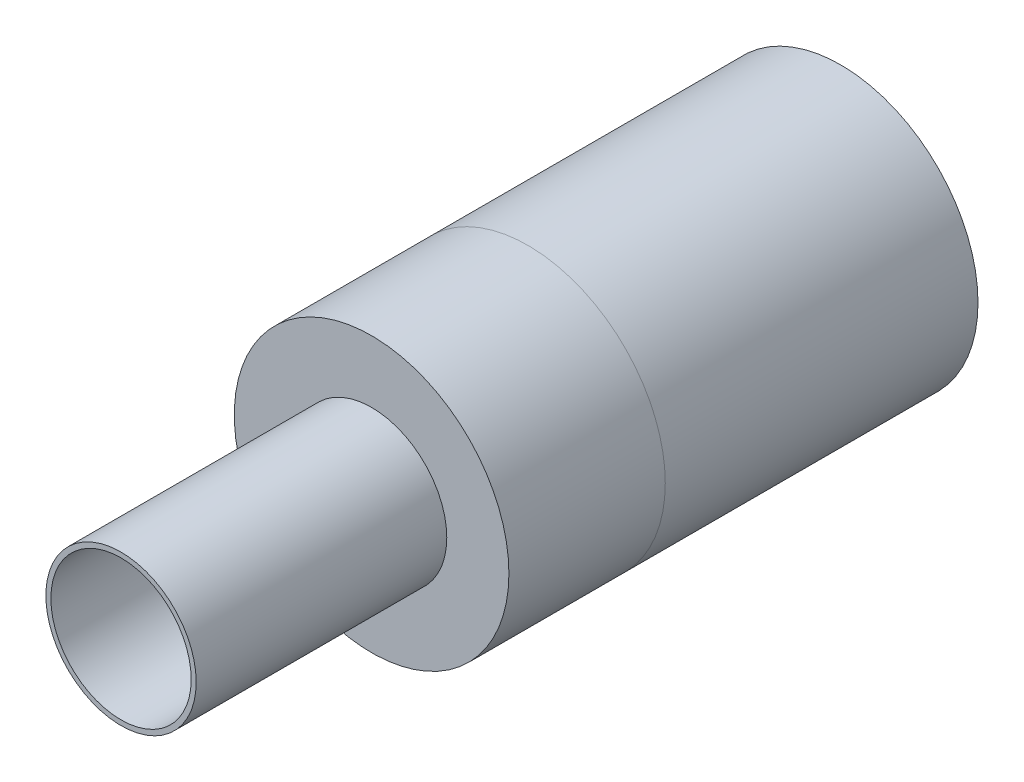
ISO-10303-21;
HEADER;
FILE_DESCRIPTION(('STEP AP214'),'2;1');
FILE_NAME('part.step','',(''),(''),'','','');
FILE_SCHEMA(('AUTOMOTIVE_DESIGN { 1 0 10303 214 1 1 1 1 }'));
ENDSEC;
DATA;
#1=APPLICATION_CONTEXT('core data for automotive mechanical design processes');
#2=APPLICATION_PROTOCOL_DEFINITION('international standard','automotive_design',2000,#1);
#3=PRODUCT_CONTEXT('',#1,'mechanical');
#4=PRODUCT('Part','Part','',(#3));
#5=PRODUCT_RELATED_PRODUCT_CATEGORY('part','',(#4));
#6=PRODUCT_DEFINITION_FORMATION('','',#4);
#7=PRODUCT_DEFINITION_CONTEXT('part definition',#1,'design');
#8=PRODUCT_DEFINITION('design','',#6,#7);
#9=PRODUCT_DEFINITION_SHAPE('','',#8);
#10=(LENGTH_UNIT() NAMED_UNIT(*) SI_UNIT(.MILLI.,.METRE.));
#11=(NAMED_UNIT(*) PLANE_ANGLE_UNIT() SI_UNIT($,.RADIAN.));
#12=(NAMED_UNIT(*) SI_UNIT($,.STERADIAN.) SOLID_ANGLE_UNIT());
#13=UNCERTAINTY_MEASURE_WITH_UNIT(LENGTH_MEASURE(1.E-05),#10,'distance_accuracy_value','');
#14=(GEOMETRIC_REPRESENTATION_CONTEXT(3) GLOBAL_UNCERTAINTY_ASSIGNED_CONTEXT((#13)) GLOBAL_UNIT_ASSIGNED_CONTEXT((#10,
#11,#12)) REPRESENTATION_CONTEXT('',''));
#15=CARTESIAN_POINT('',(0.,0.,0.));
#16=DIRECTION('',(0.,0.,1.));
#17=DIRECTION('',(1.,0.,0.));
#18=AXIS2_PLACEMENT_3D('',#15,#16,#17);
#19=CARTESIAN_POINT('',(0.,0.,59.436));
#20=DIRECTION('',(0.,0.,-1.));
#21=DIRECTION('',(-1.,0.,0.));
#22=AXIS2_PLACEMENT_3D('',#19,#20,#21);
#23=CYLINDRICAL_SURFACE('',#22,17.399);
#24=CARTESIAN_POINT('',(0.,0.,59.436));
#25=DIRECTION('',(0.,0.,1.));
#26=DIRECTION('',(1.,0.,0.));
#27=AXIS2_PLACEMENT_3D('',#24,#25,#26);
#28=CIRCLE('',#27,17.399);
#29=CARTESIAN_POINT('',(17.399,0.,59.436));
#30=VERTEX_POINT('',#29);
#31=EDGE_CURVE('E48',#30,#30,#28,.T.);
#32=ORIENTED_EDGE('',*,*,#31,.F.);
#33=EDGE_LOOP('',(#32));
#34=FACE_BOUND('',#33,.T.);
#35=CARTESIAN_POINT('',(0.,0.,39.624));
#36=DIRECTION('',(0.,0.,1.));
#37=DIRECTION('',(1.,0.,0.));
#38=AXIS2_PLACEMENT_3D('',#35,#36,#37);
#39=CIRCLE('',#38,17.399);
#40=CARTESIAN_POINT('',(17.399,0.,39.624));
#41=VERTEX_POINT('',#40);
#42=EDGE_CURVE('E11',#41,#41,#39,.T.);
#43=ORIENTED_EDGE('',*,*,#42,.T.);
#44=EDGE_LOOP('',(#43));
#45=FACE_BOUND('',#44,.T.);
#46=ADVANCED_FACE('F37',(#34,#45),#23,.T.);
#47=ORIENTED_EDGE('',*,*,#42,.F.);
#48=EDGE_LOOP('',(#47));
#49=FACE_BOUND('',#48,.T.);
#50=CARTESIAN_POINT('',(0.,0.,0.));
#51=DIRECTION('',(0.,0.,1.));
#52=DIRECTION('',(1.,0.,0.));
#53=AXIS2_PLACEMENT_3D('',#50,#51,#52);
#54=CIRCLE('',#53,17.399);
#55=CARTESIAN_POINT('',(17.399,0.,0.));
#56=VERTEX_POINT('',#55);
#57=EDGE_CURVE('E53',#56,#56,#54,.T.);
#58=ORIENTED_EDGE('',*,*,#57,.T.);
#59=EDGE_LOOP('',(#58));
#60=FACE_BOUND('',#59,.T.);
#61=ADVANCED_FACE('F39',(#49,#60),#23,.T.);
#62=CARTESIAN_POINT('',(0.,0.,59.436));
#63=DIRECTION('',(0.,0.,1.));
#64=DIRECTION('',(1.,0.,0.));
#65=AXIS2_PLACEMENT_3D('',#62,#63,#64);
#66=PLANE('',#65);
#67=CARTESIAN_POINT('',(0.,0.,59.436));
#68=DIRECTION('',(0.,0.,1.));
#69=DIRECTION('',(1.,0.,0.));
#70=AXIS2_PLACEMENT_3D('',#67,#68,#69);
#71=CIRCLE('',#70,9.525);
#72=CARTESIAN_POINT('',(9.525,0.,59.436));
#73=VERTEX_POINT('',#72);
#74=EDGE_CURVE('E44',#73,#73,#71,.T.);
#75=ORIENTED_EDGE('',*,*,#74,.F.);
#76=EDGE_LOOP('',(#75));
#77=FACE_BOUND('',#76,.T.);
#78=ORIENTED_EDGE('',*,*,#31,.T.);
#79=EDGE_LOOP('',(#78));
#80=FACE_BOUND('',#79,.T.);
#81=ADVANCED_FACE('F80',(#77,#80),#66,.T.);
#82=CARTESIAN_POINT('',(0.,0.,0.));
#83=DIRECTION('',(0.,0.,1.));
#84=DIRECTION('',(1.,0.,0.));
#85=AXIS2_PLACEMENT_3D('',#82,#83,#84);
#86=PLANE('',#85);
#87=CARTESIAN_POINT('',(0.,0.,0.));
#88=DIRECTION('',(0.,0.,-1.));
#89=DIRECTION('',(-1.,0.,0.));
#90=AXIS2_PLACEMENT_3D('',#87,#88,#89);
#91=CIRCLE('',#90,8.89);
#92=CARTESIAN_POINT('',(-8.89,0.,0.));
#93=VERTEX_POINT('',#92);
#94=EDGE_CURVE('E66',#93,#93,#91,.T.);
#95=ORIENTED_EDGE('',*,*,#94,.F.);
#96=EDGE_LOOP('',(#95));
#97=FACE_BOUND('',#96,.T.);
#98=ORIENTED_EDGE('',*,*,#57,.F.);
#99=EDGE_LOOP('',(#98));
#100=FACE_BOUND('',#99,.T.);
#101=ADVANCED_FACE('F76',(#97,#100),#86,.F.);
#102=CARTESIAN_POINT('',(0.,0.,91.186));
#103=DIRECTION('',(0.,0.,-1.));
#104=DIRECTION('',(-1.,0.,0.));
#105=AXIS2_PLACEMENT_3D('',#102,#103,#104);
#106=CYLINDRICAL_SURFACE('',#105,9.525);
#107=CARTESIAN_POINT('',(0.,0.,91.186));
#108=DIRECTION('',(0.,0.,1.));
#109=DIRECTION('',(1.,0.,0.));
#110=AXIS2_PLACEMENT_3D('',#107,#108,#109);
#111=CIRCLE('',#110,9.525);
#112=CARTESIAN_POINT('',(9.525,0.,91.186));
#113=VERTEX_POINT('',#112);
#114=EDGE_CURVE('E56',#113,#113,#111,.T.);
#115=ORIENTED_EDGE('',*,*,#114,.F.);
#116=EDGE_LOOP('',(#115));
#117=FACE_BOUND('',#116,.T.);
#118=ORIENTED_EDGE('',*,*,#74,.T.);
#119=EDGE_LOOP('',(#118));
#120=FACE_BOUND('',#119,.T.);
#121=ADVANCED_FACE('F79',(#117,#120),#106,.T.);
#122=CARTESIAN_POINT('',(0.,0.,91.186));
#123=DIRECTION('',(0.,0.,1.));
#124=DIRECTION('',(1.,0.,0.));
#125=AXIS2_PLACEMENT_3D('',#122,#123,#124);
#126=PLANE('',#125);
#127=CARTESIAN_POINT('',(0.,0.,91.186));
#128=DIRECTION('',(0.,0.,1.));
#129=DIRECTION('',(1.,0.,0.));
#130=AXIS2_PLACEMENT_3D('',#127,#128,#129);
#131=CIRCLE('',#130,8.89);
#132=CARTESIAN_POINT('',(8.89,0.,91.186));
#133=VERTEX_POINT('',#132);
#134=EDGE_CURVE('E62',#133,#133,#131,.F.);
#135=ORIENTED_EDGE('',*,*,#134,.T.);
#136=EDGE_LOOP('',(#135));
#137=FACE_BOUND('',#136,.T.);
#138=ORIENTED_EDGE('',*,*,#114,.T.);
#139=EDGE_LOOP('',(#138));
#140=FACE_BOUND('',#139,.T.);
#141=ADVANCED_FACE('F85',(#137,#140),#126,.T.);
#142=CARTESIAN_POINT('',(0.,0.,116.330717138994));
#143=DIRECTION('',(0.,0.,-1.));
#144=DIRECTION('',(-1.,0.,0.));
#145=AXIS2_PLACEMENT_3D('',#142,#143,#144);
#146=CYLINDRICAL_SURFACE('',#145,8.89);
#147=ORIENTED_EDGE('',*,*,#94,.T.);
#148=EDGE_LOOP('',(#147));
#149=FACE_BOUND('',#148,.T.);
#150=ORIENTED_EDGE('',*,*,#134,.F.);
#151=EDGE_LOOP('',(#150));
#152=FACE_BOUND('',#151,.T.);
#153=ADVANCED_FACE('F73',(#149,#152),#146,.F.);
#154=CLOSED_SHELL('',(#46,#61,#81,#101,#121,#141,#153));
#155=MANIFOLD_SOLID_BREP('B2',#154);
#156=ADVANCED_BREP_SHAPE_REPRESENTATION('',(#18,#155),#14);
#157=SHAPE_DEFINITION_REPRESENTATION(#9,#156);
ENDSEC;
END-ISO-10303-21;
